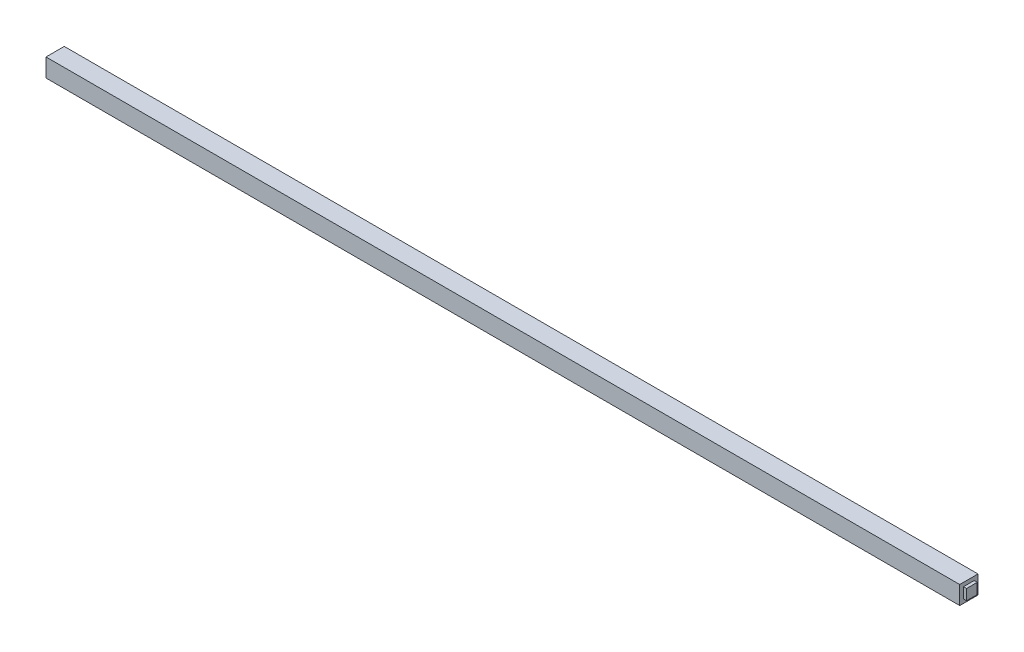
ISO-10303-21;
HEADER;
FILE_DESCRIPTION(('STEP AP214'),'2;1');
FILE_NAME('part.step','',(''),(''),'','','');
FILE_SCHEMA(('AUTOMOTIVE_DESIGN { 1 0 10303 214 1 1 1 1 }'));
ENDSEC;
DATA;
#1=APPLICATION_CONTEXT('core data for automotive mechanical design processes');
#2=APPLICATION_PROTOCOL_DEFINITION('international standard','automotive_design',2000,#1);
#3=PRODUCT_CONTEXT('',#1,'mechanical');
#4=PRODUCT('Part','Part','',(#3));
#5=PRODUCT_RELATED_PRODUCT_CATEGORY('part','',(#4));
#6=PRODUCT_DEFINITION_FORMATION('','',#4);
#7=PRODUCT_DEFINITION_CONTEXT('part definition',#1,'design');
#8=PRODUCT_DEFINITION('design','',#6,#7);
#9=PRODUCT_DEFINITION_SHAPE('','',#8);
#10=(LENGTH_UNIT() NAMED_UNIT(*) SI_UNIT(.MILLI.,.METRE.));
#11=(NAMED_UNIT(*) PLANE_ANGLE_UNIT() SI_UNIT($,.RADIAN.));
#12=(NAMED_UNIT(*) SI_UNIT($,.STERADIAN.) SOLID_ANGLE_UNIT());
#13=UNCERTAINTY_MEASURE_WITH_UNIT(LENGTH_MEASURE(1.E-05),#10,'distance_accuracy_value','');
#14=(GEOMETRIC_REPRESENTATION_CONTEXT(3) GLOBAL_UNCERTAINTY_ASSIGNED_CONTEXT((#13)) GLOBAL_UNIT_ASSIGNED_CONTEXT((#10,
#11,#12)) REPRESENTATION_CONTEXT('',''));
#15=CARTESIAN_POINT('',(0.,0.,0.));
#16=DIRECTION('',(0.,0.,1.));
#17=DIRECTION('',(1.,0.,0.));
#18=AXIS2_PLACEMENT_3D('',#15,#16,#17);
#19=CARTESIAN_POINT('',(300.,6.,0.));
#20=DIRECTION('',(-1.,0.,0.));
#21=DIRECTION('',(0.,0.,1.));
#22=AXIS2_PLACEMENT_3D('',#19,#20,#21);
#23=PLANE('',#22);
#24=DIRECTION('',(0.,0.,-1.));
#25=VECTOR('',#24,1.);
#26=CARTESIAN_POINT('',(300.,0.,0.));
#27=LINE('',#26,#25);
#28=CARTESIAN_POINT('',(300.,0.,0.));
#29=VERTEX_POINT('',#28);
#30=CARTESIAN_POINT('',(300.,0.,-6.));
#31=VERTEX_POINT('',#30);
#32=EDGE_CURVE('E247',#29,#31,#27,.T.);
#33=ORIENTED_EDGE('',*,*,#32,.T.);
#34=DIRECTION('',(0.,-1.,0.));
#35=VECTOR('',#34,1.);
#36=CARTESIAN_POINT('',(300.,6.,-6.));
#37=LINE('',#36,#35);
#38=CARTESIAN_POINT('',(300.,6.,-6.));
#39=VERTEX_POINT('',#38);
#40=EDGE_CURVE('E255',#39,#31,#37,.T.);
#41=ORIENTED_EDGE('',*,*,#40,.F.);
#42=DIRECTION('',(0.,0.,-1.));
#43=VECTOR('',#42,1.);
#44=CARTESIAN_POINT('',(300.,6.,0.));
#45=LINE('',#44,#43);
#46=CARTESIAN_POINT('',(300.,6.,0.));
#47=VERTEX_POINT('',#46);
#48=EDGE_CURVE('E234',#47,#39,#45,.T.);
#49=ORIENTED_EDGE('',*,*,#48,.F.);
#50=DIRECTION('',(0.,-1.,0.));
#51=VECTOR('',#50,1.);
#52=CARTESIAN_POINT('',(300.,6.,0.));
#53=LINE('',#52,#51);
#54=EDGE_CURVE('E52',#47,#29,#53,.T.);
#55=ORIENTED_EDGE('',*,*,#54,.T.);
#56=EDGE_LOOP('',(#33,#41,#49,#55));
#57=FACE_BOUND('',#56,.T.);
#58=DIRECTION('',(0.,1.,0.));
#59=VECTOR('',#58,1.);
#60=CARTESIAN_POINT('',(300.,4.75,-4.75));
#61=LINE('',#60,#59);
#62=CARTESIAN_POINT('',(300.,1.25,-4.75));
#63=VERTEX_POINT('',#62);
#64=CARTESIAN_POINT('',(300.,4.75,-4.75));
#65=VERTEX_POINT('',#64);
#66=EDGE_CURVE('E67',#63,#65,#61,.T.);
#67=ORIENTED_EDGE('',*,*,#66,.F.);
#68=DIRECTION('',(0.,0.,-1.));
#69=VECTOR('',#68,1.);
#70=CARTESIAN_POINT('',(300.,1.25,-1.25));
#71=LINE('',#70,#69);
#72=CARTESIAN_POINT('',(300.,1.25,-1.25));
#73=VERTEX_POINT('',#72);
#74=EDGE_CURVE('E188',#73,#63,#71,.T.);
#75=ORIENTED_EDGE('',*,*,#74,.F.);
#76=DIRECTION('',(0.,-1.,0.));
#77=VECTOR('',#76,1.);
#78=CARTESIAN_POINT('',(300.,4.75,-1.25));
#79=LINE('',#78,#77);
#80=CARTESIAN_POINT('',(300.,4.75,-1.25));
#81=VERTEX_POINT('',#80);
#82=EDGE_CURVE('E204',#81,#73,#79,.T.);
#83=ORIENTED_EDGE('',*,*,#82,.F.);
#84=DIRECTION('',(0.,0.,1.));
#85=VECTOR('',#84,1.);
#86=CARTESIAN_POINT('',(300.,4.75,-1.25));
#87=LINE('',#86,#85);
#88=EDGE_CURVE('E200',#65,#81,#87,.T.);
#89=ORIENTED_EDGE('',*,*,#88,.F.);
#90=EDGE_LOOP('',(#67,#75,#83,#89));
#91=FACE_BOUND('',#90,.T.);
#92=ADVANCED_FACE('F43',(#57,#91),#23,.F.);
#93=CARTESIAN_POINT('',(0.,6.,0.));
#94=DIRECTION('',(1.,0.,0.));
#95=DIRECTION('',(0.,0.,-1.));
#96=AXIS2_PLACEMENT_3D('',#93,#94,#95);
#97=PLANE('',#96);
#98=DIRECTION('',(0.,0.,-1.));
#99=VECTOR('',#98,1.);
#100=CARTESIAN_POINT('',(0.,1.25,-1.25));
#101=LINE('',#100,#99);
#102=CARTESIAN_POINT('',(0.,1.25,-1.25));
#103=VERTEX_POINT('',#102);
#104=CARTESIAN_POINT('',(0.,1.25,-4.75));
#105=VERTEX_POINT('',#104);
#106=EDGE_CURVE('E166',#103,#105,#101,.T.);
#107=ORIENTED_EDGE('',*,*,#106,.T.);
#108=DIRECTION('',(0.,1.,0.));
#109=VECTOR('',#108,1.);
#110=CARTESIAN_POINT('',(0.,4.75,-4.75));
#111=LINE('',#110,#109);
#112=CARTESIAN_POINT('',(0.,4.75,-4.75));
#113=VERTEX_POINT('',#112);
#114=EDGE_CURVE('E59',#105,#113,#111,.T.);
#115=ORIENTED_EDGE('',*,*,#114,.T.);
#116=DIRECTION('',(0.,0.,1.));
#117=VECTOR('',#116,1.);
#118=CARTESIAN_POINT('',(0.,4.75,-1.25));
#119=LINE('',#118,#117);
#120=CARTESIAN_POINT('',(0.,4.75,-1.25));
#121=VERTEX_POINT('',#120);
#122=EDGE_CURVE('E152',#113,#121,#119,.T.);
#123=ORIENTED_EDGE('',*,*,#122,.T.);
#124=DIRECTION('',(0.,-1.,0.));
#125=VECTOR('',#124,1.);
#126=CARTESIAN_POINT('',(0.,4.75,-1.25));
#127=LINE('',#126,#125);
#128=EDGE_CURVE('E169',#121,#103,#127,.T.);
#129=ORIENTED_EDGE('',*,*,#128,.T.);
#130=EDGE_LOOP('',(#107,#115,#123,#129));
#131=FACE_BOUND('',#130,.T.);
#132=DIRECTION('',(0.,0.,1.));
#133=VECTOR('',#132,1.);
#134=CARTESIAN_POINT('',(0.,0.,0.));
#135=LINE('',#134,#133);
#136=CARTESIAN_POINT('',(0.,0.,-6.));
#137=VERTEX_POINT('',#136);
#138=CARTESIAN_POINT('',(0.,0.,0.));
#139=VERTEX_POINT('',#138);
#140=EDGE_CURVE('E225',#137,#139,#135,.T.);
#141=ORIENTED_EDGE('',*,*,#140,.T.);
#142=DIRECTION('',(0.,-1.,0.));
#143=VECTOR('',#142,1.);
#144=CARTESIAN_POINT('',(0.,6.,0.));
#145=LINE('',#144,#143);
#146=CARTESIAN_POINT('',(0.,6.,0.));
#147=VERTEX_POINT('',#146);
#148=EDGE_CURVE('E11',#147,#139,#145,.T.);
#149=ORIENTED_EDGE('',*,*,#148,.F.);
#150=DIRECTION('',(0.,0.,1.));
#151=VECTOR('',#150,1.);
#152=CARTESIAN_POINT('',(0.,6.,0.));
#153=LINE('',#152,#151);
#154=CARTESIAN_POINT('',(0.,6.,-6.));
#155=VERTEX_POINT('',#154);
#156=EDGE_CURVE('E226',#155,#147,#153,.T.);
#157=ORIENTED_EDGE('',*,*,#156,.F.);
#158=DIRECTION('',(0.,-1.,0.));
#159=VECTOR('',#158,1.);
#160=CARTESIAN_POINT('',(0.,6.,-6.));
#161=LINE('',#160,#159);
#162=EDGE_CURVE('E240',#155,#137,#161,.T.);
#163=ORIENTED_EDGE('',*,*,#162,.T.);
#164=EDGE_LOOP('',(#141,#149,#157,#163));
#165=FACE_BOUND('',#164,.T.);
#166=ADVANCED_FACE('F45',(#131,#165),#97,.F.);
#167=CARTESIAN_POINT('',(0.,6.,0.));
#168=DIRECTION('',(0.,0.,-1.));
#169=DIRECTION('',(-1.,0.,0.));
#170=AXIS2_PLACEMENT_3D('',#167,#168,#169);
#171=PLANE('',#170);
#172=DIRECTION('',(1.,0.,0.));
#173=VECTOR('',#172,1.);
#174=CARTESIAN_POINT('',(0.,0.,0.));
#175=LINE('',#174,#173);
#176=EDGE_CURVE('E244',#139,#29,#175,.T.);
#177=ORIENTED_EDGE('',*,*,#176,.T.);
#178=ORIENTED_EDGE('',*,*,#54,.F.);
#179=DIRECTION('',(1.,0.,0.));
#180=VECTOR('',#179,1.);
#181=CARTESIAN_POINT('',(0.,6.,0.));
#182=LINE('',#181,#180);
#183=EDGE_CURVE('E230',#147,#47,#182,.T.);
#184=ORIENTED_EDGE('',*,*,#183,.F.);
#185=ORIENTED_EDGE('',*,*,#148,.T.);
#186=EDGE_LOOP('',(#177,#178,#184,#185));
#187=FACE_BOUND('',#186,.T.);
#188=ADVANCED_FACE('F279',(#187),#171,.F.);
#189=CARTESIAN_POINT('',(0.,6.,-6.));
#190=DIRECTION('',(0.,0.,1.));
#191=DIRECTION('',(1.,0.,0.));
#192=AXIS2_PLACEMENT_3D('',#189,#190,#191);
#193=PLANE('',#192);
#194=DIRECTION('',(-1.,0.,0.));
#195=VECTOR('',#194,1.);
#196=CARTESIAN_POINT('',(0.,0.,-6.));
#197=LINE('',#196,#195);
#198=EDGE_CURVE('E231',#31,#137,#197,.T.);
#199=ORIENTED_EDGE('',*,*,#198,.T.);
#200=ORIENTED_EDGE('',*,*,#162,.F.);
#201=DIRECTION('',(-1.,0.,0.));
#202=VECTOR('',#201,1.);
#203=CARTESIAN_POINT('',(0.,6.,-6.));
#204=LINE('',#203,#202);
#205=EDGE_CURVE('E237',#39,#155,#204,.T.);
#206=ORIENTED_EDGE('',*,*,#205,.F.);
#207=ORIENTED_EDGE('',*,*,#40,.T.);
#208=EDGE_LOOP('',(#199,#200,#206,#207));
#209=FACE_BOUND('',#208,.T.);
#210=ADVANCED_FACE('F272',(#209),#193,.F.);
#211=CARTESIAN_POINT('',(0.,6.,0.));
#212=DIRECTION('',(0.,-1.,0.));
#213=DIRECTION('',(0.,0.,-1.));
#214=AXIS2_PLACEMENT_3D('',#211,#212,#213);
#215=PLANE('',#214);
#216=ORIENTED_EDGE('',*,*,#156,.T.);
#217=ORIENTED_EDGE('',*,*,#183,.T.);
#218=ORIENTED_EDGE('',*,*,#48,.T.);
#219=ORIENTED_EDGE('',*,*,#205,.T.);
#220=EDGE_LOOP('',(#216,#217,#218,#219));
#221=FACE_BOUND('',#220,.T.);
#222=ADVANCED_FACE('F278',(#221),#215,.F.);
#223=CARTESIAN_POINT('',(0.,0.,0.));
#224=DIRECTION('',(0.,-1.,0.));
#225=DIRECTION('',(0.,0.,-1.));
#226=AXIS2_PLACEMENT_3D('',#223,#224,#225);
#227=PLANE('',#226);
#228=ORIENTED_EDGE('',*,*,#140,.F.);
#229=ORIENTED_EDGE('',*,*,#198,.F.);
#230=ORIENTED_EDGE('',*,*,#32,.F.);
#231=ORIENTED_EDGE('',*,*,#176,.F.);
#232=EDGE_LOOP('',(#228,#229,#230,#231));
#233=FACE_BOUND('',#232,.T.);
#234=ADVANCED_FACE('F269',(#233),#227,.T.);
#235=CARTESIAN_POINT('',(301.,4.75,-4.75));
#236=DIRECTION('',(0.,0.,1.));
#237=DIRECTION('',(0.,-1.,0.));
#238=AXIS2_PLACEMENT_3D('',#235,#236,#237);
#239=PLANE('',#238);
#240=ORIENTED_EDGE('',*,*,#66,.T.);
#241=DIRECTION('',(-1.,0.,0.));
#242=VECTOR('',#241,1.);
#243=CARTESIAN_POINT('',(301.,4.75,-4.75));
#244=LINE('',#243,#242);
#245=CARTESIAN_POINT('',(301.,4.75,-4.75));
#246=VERTEX_POINT('',#245);
#247=EDGE_CURVE('E221',#246,#65,#244,.T.);
#248=ORIENTED_EDGE('',*,*,#247,.F.);
#249=DIRECTION('',(0.,1.,0.));
#250=VECTOR('',#249,1.);
#251=CARTESIAN_POINT('',(301.,4.75,-4.75));
#252=LINE('',#251,#250);
#253=CARTESIAN_POINT('',(301.,1.25,-4.75));
#254=VERTEX_POINT('',#253);
#255=EDGE_CURVE('E183',#254,#246,#252,.T.);
#256=ORIENTED_EDGE('',*,*,#255,.F.);
#257=DIRECTION('',(-1.,0.,0.));
#258=VECTOR('',#257,1.);
#259=CARTESIAN_POINT('',(301.,1.25,-4.75));
#260=LINE('',#259,#258);
#261=EDGE_CURVE('E197',#254,#63,#260,.T.);
#262=ORIENTED_EDGE('',*,*,#261,.T.);
#263=EDGE_LOOP('',(#240,#248,#256,#262));
#264=FACE_BOUND('',#263,.T.);
#265=ADVANCED_FACE('F294',(#264),#239,.F.);
#266=CARTESIAN_POINT('',(301.,4.75,-1.25));
#267=DIRECTION('',(0.,-1.,0.));
#268=DIRECTION('',(0.,0.,-1.));
#269=AXIS2_PLACEMENT_3D('',#266,#267,#268);
#270=PLANE('',#269);
#271=ORIENTED_EDGE('',*,*,#88,.T.);
#272=DIRECTION('',(-1.,0.,0.));
#273=VECTOR('',#272,1.);
#274=CARTESIAN_POINT('',(301.,4.75,-1.25));
#275=LINE('',#274,#273);
#276=CARTESIAN_POINT('',(301.,4.75,-1.25));
#277=VERTEX_POINT('',#276);
#278=EDGE_CURVE('E217',#277,#81,#275,.T.);
#279=ORIENTED_EDGE('',*,*,#278,.F.);
#280=DIRECTION('',(0.,0.,1.));
#281=VECTOR('',#280,1.);
#282=CARTESIAN_POINT('',(301.,4.75,-1.25));
#283=LINE('',#282,#281);
#284=EDGE_CURVE('E187',#246,#277,#283,.T.);
#285=ORIENTED_EDGE('',*,*,#284,.F.);
#286=ORIENTED_EDGE('',*,*,#247,.T.);
#287=EDGE_LOOP('',(#271,#279,#285,#286));
#288=FACE_BOUND('',#287,.T.);
#289=ADVANCED_FACE('F299',(#288),#270,.F.);
#290=CARTESIAN_POINT('',(301.,4.75,-1.25));
#291=DIRECTION('',(0.,0.,-1.));
#292=DIRECTION('',(0.,1.,0.));
#293=AXIS2_PLACEMENT_3D('',#290,#291,#292);
#294=PLANE('',#293);
#295=ORIENTED_EDGE('',*,*,#82,.T.);
#296=DIRECTION('',(-1.,0.,0.));
#297=VECTOR('',#296,1.);
#298=CARTESIAN_POINT('',(301.,1.25,-1.25));
#299=LINE('',#298,#297);
#300=CARTESIAN_POINT('',(301.,1.25,-1.25));
#301=VERTEX_POINT('',#300);
#302=EDGE_CURVE('E213',#301,#73,#299,.T.);
#303=ORIENTED_EDGE('',*,*,#302,.F.);
#304=DIRECTION('',(0.,-1.,0.));
#305=VECTOR('',#304,1.);
#306=CARTESIAN_POINT('',(301.,4.75,-1.25));
#307=LINE('',#306,#305);
#308=EDGE_CURVE('E191',#277,#301,#307,.T.);
#309=ORIENTED_EDGE('',*,*,#308,.F.);
#310=ORIENTED_EDGE('',*,*,#278,.T.);
#311=EDGE_LOOP('',(#295,#303,#309,#310));
#312=FACE_BOUND('',#311,.T.);
#313=ADVANCED_FACE('F303',(#312),#294,.F.);
#314=CARTESIAN_POINT('',(301.,1.25,-1.25));
#315=DIRECTION('',(0.,1.,0.));
#316=DIRECTION('',(0.,0.,1.));
#317=AXIS2_PLACEMENT_3D('',#314,#315,#316);
#318=PLANE('',#317);
#319=ORIENTED_EDGE('',*,*,#74,.T.);
#320=ORIENTED_EDGE('',*,*,#261,.F.);
#321=DIRECTION('',(0.,0.,-1.));
#322=VECTOR('',#321,1.);
#323=CARTESIAN_POINT('',(301.,1.25,-1.25));
#324=LINE('',#323,#322);
#325=EDGE_CURVE('E194',#301,#254,#324,.T.);
#326=ORIENTED_EDGE('',*,*,#325,.F.);
#327=ORIENTED_EDGE('',*,*,#302,.T.);
#328=EDGE_LOOP('',(#319,#320,#326,#327));
#329=FACE_BOUND('',#328,.T.);
#330=ADVANCED_FACE('F307',(#329),#318,.F.);
#331=CARTESIAN_POINT('',(301.,0.,0.));
#332=DIRECTION('',(1.,0.,0.));
#333=DIRECTION('',(0.,0.,-1.));
#334=AXIS2_PLACEMENT_3D('',#331,#332,#333);
#335=PLANE('',#334);
#336=ORIENTED_EDGE('',*,*,#255,.T.);
#337=ORIENTED_EDGE('',*,*,#284,.T.);
#338=ORIENTED_EDGE('',*,*,#308,.T.);
#339=ORIENTED_EDGE('',*,*,#325,.T.);
#340=EDGE_LOOP('',(#336,#337,#338,#339));
#341=FACE_BOUND('',#340,.T.);
#342=ADVANCED_FACE('F311',(#341),#335,.T.);
#343=CARTESIAN_POINT('',(-1.,4.75,-4.75));
#344=DIRECTION('',(0.,0.,-1.));
#345=DIRECTION('',(0.,1.,0.));
#346=AXIS2_PLACEMENT_3D('',#343,#344,#345);
#347=PLANE('',#346);
#348=ORIENTED_EDGE('',*,*,#114,.F.);
#349=DIRECTION('',(1.,0.,0.));
#350=VECTOR('',#349,1.);
#351=CARTESIAN_POINT('',(-1.,1.25,-4.75));
#352=LINE('',#351,#350);
#353=CARTESIAN_POINT('',(-1.,1.25,-4.75));
#354=VERTEX_POINT('',#353);
#355=EDGE_CURVE('E131',#354,#105,#352,.T.);
#356=ORIENTED_EDGE('',*,*,#355,.F.);
#357=DIRECTION('',(0.,1.,0.));
#358=VECTOR('',#357,1.);
#359=CARTESIAN_POINT('',(-1.,4.75,-4.75));
#360=LINE('',#359,#358);
#361=CARTESIAN_POINT('',(-1.,4.75,-4.75));
#362=VERTEX_POINT('',#361);
#363=EDGE_CURVE('E134',#354,#362,#360,.T.);
#364=ORIENTED_EDGE('',*,*,#363,.T.);
#365=DIRECTION('',(1.,0.,0.));
#366=VECTOR('',#365,1.);
#367=CARTESIAN_POINT('',(-1.,4.75,-4.75));
#368=LINE('',#367,#366);
#369=EDGE_CURVE('E163',#362,#113,#368,.T.);
#370=ORIENTED_EDGE('',*,*,#369,.T.);
#371=EDGE_LOOP('',(#348,#356,#364,#370));
#372=FACE_BOUND('',#371,.T.);
#373=ADVANCED_FACE('F133',(#372),#347,.T.);
#374=CARTESIAN_POINT('',(-1.,1.25,-1.25));
#375=DIRECTION('',(0.,-1.,0.));
#376=DIRECTION('',(0.,0.,-1.));
#377=AXIS2_PLACEMENT_3D('',#374,#375,#376);
#378=PLANE('',#377);
#379=ORIENTED_EDGE('',*,*,#106,.F.);
#380=DIRECTION('',(1.,0.,0.));
#381=VECTOR('',#380,1.);
#382=CARTESIAN_POINT('',(-1.,1.25,-1.25));
#383=LINE('',#382,#381);
#384=CARTESIAN_POINT('',(-1.,1.25,-1.25));
#385=VERTEX_POINT('',#384);
#386=EDGE_CURVE('E141',#385,#103,#383,.T.);
#387=ORIENTED_EDGE('',*,*,#386,.F.);
#388=DIRECTION('',(0.,0.,-1.));
#389=VECTOR('',#388,1.);
#390=CARTESIAN_POINT('',(-1.,1.25,-1.25));
#391=LINE('',#390,#389);
#392=EDGE_CURVE('E147',#385,#354,#391,.T.);
#393=ORIENTED_EDGE('',*,*,#392,.T.);
#394=ORIENTED_EDGE('',*,*,#355,.T.);
#395=EDGE_LOOP('',(#379,#387,#393,#394));
#396=FACE_BOUND('',#395,.T.);
#397=ADVANCED_FACE('F154',(#396),#378,.T.);
#398=CARTESIAN_POINT('',(-1.,4.75,-1.25));
#399=DIRECTION('',(0.,0.,1.));
#400=DIRECTION('',(0.,-1.,0.));
#401=AXIS2_PLACEMENT_3D('',#398,#399,#400);
#402=PLANE('',#401);
#403=ORIENTED_EDGE('',*,*,#128,.F.);
#404=DIRECTION('',(1.,0.,0.));
#405=VECTOR('',#404,1.);
#406=CARTESIAN_POINT('',(-1.,4.75,-1.25));
#407=LINE('',#406,#405);
#408=CARTESIAN_POINT('',(-1.,4.75,-1.25));
#409=VERTEX_POINT('',#408);
#410=EDGE_CURVE('E178',#409,#121,#407,.T.);
#411=ORIENTED_EDGE('',*,*,#410,.F.);
#412=DIRECTION('',(0.,-1.,0.));
#413=VECTOR('',#412,1.);
#414=CARTESIAN_POINT('',(-1.,4.75,-1.25));
#415=LINE('',#414,#413);
#416=EDGE_CURVE('E156',#409,#385,#415,.T.);
#417=ORIENTED_EDGE('',*,*,#416,.T.);
#418=ORIENTED_EDGE('',*,*,#386,.T.);
#419=EDGE_LOOP('',(#403,#411,#417,#418));
#420=FACE_BOUND('',#419,.T.);
#421=ADVANCED_FACE('F320',(#420),#402,.T.);
#422=CARTESIAN_POINT('',(-1.,4.75,-1.25));
#423=DIRECTION('',(0.,1.,0.));
#424=DIRECTION('',(0.,0.,1.));
#425=AXIS2_PLACEMENT_3D('',#422,#423,#424);
#426=PLANE('',#425);
#427=ORIENTED_EDGE('',*,*,#122,.F.);
#428=ORIENTED_EDGE('',*,*,#369,.F.);
#429=DIRECTION('',(0.,0.,1.));
#430=VECTOR('',#429,1.);
#431=CARTESIAN_POINT('',(-1.,4.75,-1.25));
#432=LINE('',#431,#430);
#433=EDGE_CURVE('E150',#362,#409,#432,.T.);
#434=ORIENTED_EDGE('',*,*,#433,.T.);
#435=ORIENTED_EDGE('',*,*,#410,.T.);
#436=EDGE_LOOP('',(#427,#428,#434,#435));
#437=FACE_BOUND('',#436,.T.);
#438=ADVANCED_FACE('F323',(#437),#426,.T.);
#439=CARTESIAN_POINT('',(-1.,0.,0.));
#440=DIRECTION('',(-1.,0.,0.));
#441=DIRECTION('',(0.,0.,-1.));
#442=AXIS2_PLACEMENT_3D('',#439,#440,#441);
#443=PLANE('',#442);
#444=ORIENTED_EDGE('',*,*,#363,.F.);
#445=ORIENTED_EDGE('',*,*,#392,.F.);
#446=ORIENTED_EDGE('',*,*,#416,.F.);
#447=ORIENTED_EDGE('',*,*,#433,.F.);
#448=EDGE_LOOP('',(#444,#445,#446,#447));
#449=FACE_BOUND('',#448,.T.);
#450=ADVANCED_FACE('F145',(#449),#443,.T.);
#451=CLOSED_SHELL('',(#92,#166,#188,#210,#222,#234,#265,#289,#313,#330,#342,#373,#397,#421,#438,#450));
#452=MANIFOLD_SOLID_BREP('B2',#451);
#453=ADVANCED_BREP_SHAPE_REPRESENTATION('',(#18,#452),#14);
#454=SHAPE_DEFINITION_REPRESENTATION(#9,#453);
ENDSEC;
END-ISO-10303-21;
